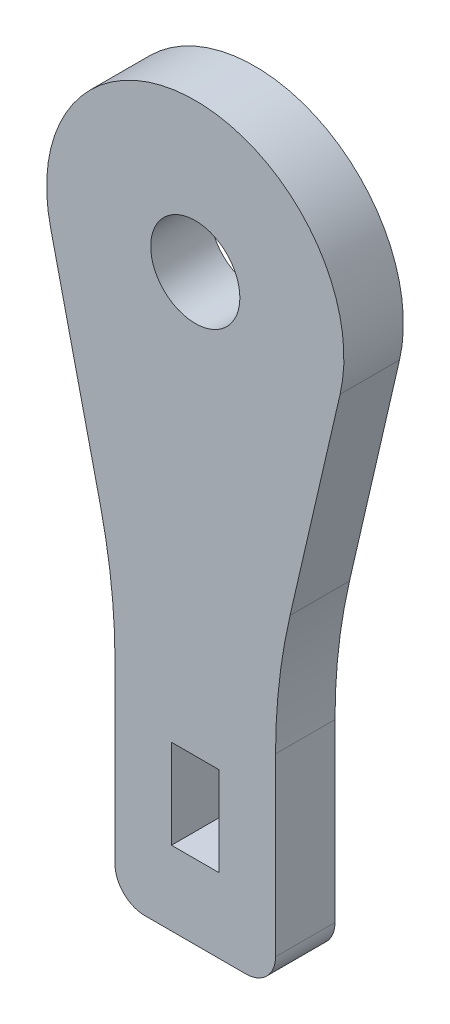
ISO-10303-21;
HEADER;
FILE_DESCRIPTION(('STEP AP214'),'2;1');
FILE_NAME('part.step','',(''),(''),'','','');
FILE_SCHEMA(('AUTOMOTIVE_DESIGN { 1 0 10303 214 1 1 1 1 }'));
ENDSEC;
DATA;
#1=APPLICATION_CONTEXT('core data for automotive mechanical design processes');
#2=APPLICATION_PROTOCOL_DEFINITION('international standard','automotive_design',2000,#1);
#3=PRODUCT_CONTEXT('',#1,'mechanical');
#4=PRODUCT('Part','Part','',(#3));
#5=PRODUCT_RELATED_PRODUCT_CATEGORY('part','',(#4));
#6=PRODUCT_DEFINITION_FORMATION('','',#4);
#7=PRODUCT_DEFINITION_CONTEXT('part definition',#1,'design');
#8=PRODUCT_DEFINITION('design','',#6,#7);
#9=PRODUCT_DEFINITION_SHAPE('','',#8);
#10=(LENGTH_UNIT() NAMED_UNIT(*) SI_UNIT(.MILLI.,.METRE.));
#11=(NAMED_UNIT(*) PLANE_ANGLE_UNIT() SI_UNIT($,.RADIAN.));
#12=(NAMED_UNIT(*) SI_UNIT($,.STERADIAN.) SOLID_ANGLE_UNIT());
#13=UNCERTAINTY_MEASURE_WITH_UNIT(LENGTH_MEASURE(1.E-05),#10,'distance_accuracy_value','');
#14=(GEOMETRIC_REPRESENTATION_CONTEXT(3) GLOBAL_UNCERTAINTY_ASSIGNED_CONTEXT((#13)) GLOBAL_UNIT_ASSIGNED_CONTEXT((#10,
#11,#12)) REPRESENTATION_CONTEXT('',''));
#15=CARTESIAN_POINT('',(0.,0.,0.));
#16=DIRECTION('',(0.,0.,1.));
#17=DIRECTION('',(1.,0.,0.));
#18=AXIS2_PLACEMENT_3D('',#15,#16,#17);
#19=CARTESIAN_POINT('',(-55.0000000000146,-1.51941047348276E-11,10.));
#20=DIRECTION('',(0.,0.,1.));
#21=DIRECTION('',(1.,0.,0.));
#22=AXIS2_PLACEMENT_3D('',#19,#20,#21);
#23=PLANE('',#22);
#24=CARTESIAN_POINT('',(-55.0000000000146,-1.51941047348276E-11,10.));
#25=DIRECTION('',(0.,0.,1.));
#26=DIRECTION('',(1.,0.,0.));
#27=AXIS2_PLACEMENT_3D('',#24,#25,#26);
#28=CIRCLE('',#27,25.);
#29=CARTESIAN_POINT('',(-30.6420643207286,-5.62947328299327,10.));
#30=VERTEX_POINT('',#29);
#31=CARTESIAN_POINT('',(-79.3579356793006,-5.62947328299327,10.));
#32=VERTEX_POINT('',#31);
#33=EDGE_CURVE('E182',#30,#32,#28,.T.);
#34=ORIENTED_EDGE('',*,*,#33,.T.);
#35=DIRECTION('',(0.225178931319123,-0.974317427171442,0.));
#36=VECTOR('',#35,1.);
#37=CARTESIAN_POINT('',(-79.3579356793006,-5.62947328299327,10.));
#38=LINE('',#37,#36);
#39=CARTESIAN_POINT('',(-70.9410499161308,-42.0481490157845,10.));
#40=VERTEX_POINT('',#39);
#41=EDGE_CURVE('E185',#32,#40,#38,.T.);
#42=ORIENTED_EDGE('',*,*,#41,.T.);
#43=CARTESIAN_POINT('',(-163.501205497418,-63.4401474911012,10.));
#44=DIRECTION('',(0.,0.,-1.));
#45=DIRECTION('',(1.,0.,0.));
#46=AXIS2_PLACEMENT_3D('',#43,#44,#45);
#47=CIRCLE('',#46,95.);
#48=CARTESIAN_POINT('',(-68.5012054974177,-63.4401474911012,10.));
#49=VERTEX_POINT('',#48);
#50=EDGE_CURVE('E188',#40,#49,#47,.T.);
#51=ORIENTED_EDGE('',*,*,#50,.T.);
#52=DIRECTION('',(0.,-1.,0.));
#53=VECTOR('',#52,1.);
#54=CARTESIAN_POINT('',(-68.5012054974177,-63.4401474911012,10.));
#55=LINE('',#54,#53);
#56=CARTESIAN_POINT('',(-68.5012054974177,-93.0000000000151,10.));
#57=VERTEX_POINT('',#56);
#58=EDGE_CURVE('E190',#49,#57,#55,.T.);
#59=ORIENTED_EDGE('',*,*,#58,.T.);
#60=CARTESIAN_POINT('',(-63.5012054974177,-93.0000000000152,10.));
#61=DIRECTION('',(0.,0.,1.));
#62=DIRECTION('',(-1.,0.,0.));
#63=AXIS2_PLACEMENT_3D('',#60,#61,#62);
#64=CIRCLE('',#63,5.);
#65=CARTESIAN_POINT('',(-63.5012054974177,-98.0000000000152,10.));
#66=VERTEX_POINT('',#65);
#67=EDGE_CURVE('E192',#57,#66,#64,.T.);
#68=ORIENTED_EDGE('',*,*,#67,.T.);
#69=DIRECTION('',(1.,0.,0.));
#70=VECTOR('',#69,1.);
#71=CARTESIAN_POINT('',(-63.5012054974177,-98.0000000000152,10.));
#72=LINE('',#71,#70);
#73=CARTESIAN_POINT('',(-46.4987945026115,-98.0000000000152,10.));
#74=VERTEX_POINT('',#73);
#75=EDGE_CURVE('E194',#66,#74,#72,.T.);
#76=ORIENTED_EDGE('',*,*,#75,.T.);
#77=CARTESIAN_POINT('',(-46.4987945026114,-93.0000000000152,10.));
#78=DIRECTION('',(0.,0.,1.));
#79=DIRECTION('',(-1.,0.,0.));
#80=AXIS2_PLACEMENT_3D('',#77,#78,#79);
#81=CIRCLE('',#80,5.);
#82=CARTESIAN_POINT('',(-41.4987945026114,-93.0000000000151,10.));
#83=VERTEX_POINT('',#82);
#84=EDGE_CURVE('E196',#74,#83,#81,.T.);
#85=ORIENTED_EDGE('',*,*,#84,.T.);
#86=DIRECTION('',(0.,1.,0.));
#87=VECTOR('',#86,1.);
#88=CARTESIAN_POINT('',(-41.4987945026115,-63.4401474911012,10.));
#89=LINE('',#88,#87);
#90=CARTESIAN_POINT('',(-41.4987945026115,-63.4401474911012,10.));
#91=VERTEX_POINT('',#90);
#92=EDGE_CURVE('E198',#83,#91,#89,.T.);
#93=ORIENTED_EDGE('',*,*,#92,.T.);
#94=CARTESIAN_POINT('',(53.5012054973885,-63.4401474911012,10.));
#95=DIRECTION('',(0.,0.,-1.));
#96=DIRECTION('',(-1.,0.,0.));
#97=AXIS2_PLACEMENT_3D('',#94,#95,#96);
#98=CIRCLE('',#97,95.);
#99=CARTESIAN_POINT('',(-39.0589500838984,-42.0481490157845,10.));
#100=VERTEX_POINT('',#99);
#101=EDGE_CURVE('E200',#91,#100,#98,.T.);
#102=ORIENTED_EDGE('',*,*,#101,.T.);
#103=DIRECTION('',(0.225178931319123,0.974317427171442,0.));
#104=VECTOR('',#103,1.);
#105=CARTESIAN_POINT('',(-30.6420643207286,-5.62947328299327,10.));
#106=LINE('',#105,#104);
#107=EDGE_CURVE('E202',#100,#30,#106,.T.);
#108=ORIENTED_EDGE('',*,*,#107,.T.);
#109=EDGE_LOOP('',(#34,#42,#51,#59,#68,#76,#85,#93,#102,#108));
#110=FACE_BOUND('',#109,.T.);
#111=CARTESIAN_POINT('',(-55.0000000000146,-1.51941047348276E-11,10.));
#112=DIRECTION('',(0.,0.,1.));
#113=DIRECTION('',(1.,0.,0.));
#114=AXIS2_PLACEMENT_3D('',#111,#112,#113);
#115=CIRCLE('',#114,7.50000000000527);
#116=CARTESIAN_POINT('',(-47.5000000000093,-1.51941047348276E-11,10.));
#117=VERTEX_POINT('',#116);
#118=EDGE_CURVE('E176',#117,#117,#115,.T.);
#119=ORIENTED_EDGE('',*,*,#118,.F.);
#120=EDGE_LOOP('',(#119));
#121=FACE_BOUND('',#120,.T.);
#122=DIRECTION('',(-1.,0.,0.));
#123=VECTOR('',#122,1.);
#124=CARTESIAN_POINT('',(-59.0000000000146,-70.5000000000152,10.));
#125=LINE('',#124,#123);
#126=CARTESIAN_POINT('',(-51.0000000000146,-70.5000000000152,10.));
#127=VERTEX_POINT('',#126);
#128=CARTESIAN_POINT('',(-59.0000000000146,-70.5000000000152,10.));
#129=VERTEX_POINT('',#128);
#130=EDGE_CURVE('E148',#127,#129,#125,.T.);
#131=ORIENTED_EDGE('',*,*,#130,.F.);
#132=DIRECTION('',(0.,1.,0.));
#133=VECTOR('',#132,1.);
#134=CARTESIAN_POINT('',(-51.0000000000146,-70.5000000000152,10.));
#135=LINE('',#134,#133);
#136=CARTESIAN_POINT('',(-51.0000000000146,-85.5000000000152,10.));
#137=VERTEX_POINT('',#136);
#138=EDGE_CURVE('E140',#137,#127,#135,.T.);
#139=ORIENTED_EDGE('',*,*,#138,.F.);
#140=DIRECTION('',(1.,0.,0.));
#141=VECTOR('',#140,1.);
#142=CARTESIAN_POINT('',(-59.0000000000146,-85.5000000000152,10.));
#143=LINE('',#142,#141);
#144=CARTESIAN_POINT('',(-59.0000000000146,-85.5000000000152,10.));
#145=VERTEX_POINT('',#144);
#146=EDGE_CURVE('E162',#145,#137,#143,.T.);
#147=ORIENTED_EDGE('',*,*,#146,.F.);
#148=DIRECTION('',(0.,-1.,0.));
#149=VECTOR('',#148,1.);
#150=CARTESIAN_POINT('',(-59.0000000000146,-70.5000000000152,10.));
#151=LINE('',#150,#149);
#152=EDGE_CURVE('E160',#129,#145,#151,.T.);
#153=ORIENTED_EDGE('',*,*,#152,.F.);
#154=EDGE_LOOP('',(#131,#139,#147,#153));
#155=FACE_BOUND('',#154,.T.);
#156=ADVANCED_FACE('F39',(#110,#121,#155),#23,.T.);
#157=CARTESIAN_POINT('',(-55.0000000000146,-1.51941047348276E-11,0.));
#158=DIRECTION('',(0.,0.,1.));
#159=DIRECTION('',(1.,0.,0.));
#160=AXIS2_PLACEMENT_3D('',#157,#158,#159);
#161=PLANE('',#160);
#162=CARTESIAN_POINT('',(-55.0000000000146,-1.51941047348276E-11,0.));
#163=DIRECTION('',(0.,0.,1.));
#164=DIRECTION('',(1.,0.,0.));
#165=AXIS2_PLACEMENT_3D('',#162,#163,#164);
#166=CIRCLE('',#165,7.50000000000527);
#167=CARTESIAN_POINT('',(-47.5000000000093,-1.51941047348276E-11,0.));
#168=VERTEX_POINT('',#167);
#169=EDGE_CURVE('E156',#168,#168,#166,.T.);
#170=ORIENTED_EDGE('',*,*,#169,.T.);
#171=EDGE_LOOP('',(#170));
#172=FACE_BOUND('',#171,.T.);
#173=CARTESIAN_POINT('',(-55.0000000000146,-1.51941047348276E-11,0.));
#174=DIRECTION('',(0.,0.,1.));
#175=DIRECTION('',(1.,0.,0.));
#176=AXIS2_PLACEMENT_3D('',#173,#174,#175);
#177=CIRCLE('',#176,25.);
#178=CARTESIAN_POINT('',(-30.6420643207286,-5.62947328299327,0.));
#179=VERTEX_POINT('',#178);
#180=CARTESIAN_POINT('',(-79.3579356793006,-5.62947328299327,0.));
#181=VERTEX_POINT('',#180);
#182=EDGE_CURVE('E179',#179,#181,#177,.T.);
#183=ORIENTED_EDGE('',*,*,#182,.F.);
#184=DIRECTION('',(0.225178931319123,0.974317427171442,0.));
#185=VECTOR('',#184,1.);
#186=CARTESIAN_POINT('',(-30.6420643207286,-5.62947328299327,0.));
#187=LINE('',#186,#185);
#188=CARTESIAN_POINT('',(-39.0589500838984,-42.0481490157845,0.));
#189=VERTEX_POINT('',#188);
#190=EDGE_CURVE('E186',#189,#179,#187,.T.);
#191=ORIENTED_EDGE('',*,*,#190,.F.);
#192=CARTESIAN_POINT('',(53.5012054973885,-63.4401474911012,0.));
#193=DIRECTION('',(0.,0.,-1.));
#194=DIRECTION('',(-1.,0.,0.));
#195=AXIS2_PLACEMENT_3D('',#192,#193,#194);
#196=CIRCLE('',#195,95.);
#197=CARTESIAN_POINT('',(-41.4987945026115,-63.4401474911012,0.));
#198=VERTEX_POINT('',#197);
#199=EDGE_CURVE('E221',#198,#189,#196,.T.);
#200=ORIENTED_EDGE('',*,*,#199,.F.);
#201=DIRECTION('',(0.,1.,0.));
#202=VECTOR('',#201,1.);
#203=CARTESIAN_POINT('',(-41.4987945026115,-63.4401474911012,0.));
#204=LINE('',#203,#202);
#205=CARTESIAN_POINT('',(-41.4987945026114,-93.0000000000151,0.));
#206=VERTEX_POINT('',#205);
#207=EDGE_CURVE('E219',#206,#198,#204,.T.);
#208=ORIENTED_EDGE('',*,*,#207,.F.);
#209=CARTESIAN_POINT('',(-46.4987945026114,-93.0000000000152,0.));
#210=DIRECTION('',(0.,0.,1.));
#211=DIRECTION('',(-1.,0.,0.));
#212=AXIS2_PLACEMENT_3D('',#209,#210,#211);
#213=CIRCLE('',#212,5.);
#214=CARTESIAN_POINT('',(-46.4987945026115,-98.0000000000152,0.));
#215=VERTEX_POINT('',#214);
#216=EDGE_CURVE('E217',#215,#206,#213,.T.);
#217=ORIENTED_EDGE('',*,*,#216,.F.);
#218=DIRECTION('',(1.,0.,0.));
#219=VECTOR('',#218,1.);
#220=CARTESIAN_POINT('',(-63.5012054974177,-98.0000000000152,0.));
#221=LINE('',#220,#219);
#222=CARTESIAN_POINT('',(-63.5012054974177,-98.0000000000152,0.));
#223=VERTEX_POINT('',#222);
#224=EDGE_CURVE('E215',#223,#215,#221,.T.);
#225=ORIENTED_EDGE('',*,*,#224,.F.);
#226=CARTESIAN_POINT('',(-63.5012054974177,-93.0000000000152,0.));
#227=DIRECTION('',(0.,0.,1.));
#228=DIRECTION('',(-1.,0.,0.));
#229=AXIS2_PLACEMENT_3D('',#226,#227,#228);
#230=CIRCLE('',#229,5.);
#231=CARTESIAN_POINT('',(-68.5012054974177,-93.0000000000151,0.));
#232=VERTEX_POINT('',#231);
#233=EDGE_CURVE('E213',#232,#223,#230,.T.);
#234=ORIENTED_EDGE('',*,*,#233,.F.);
#235=DIRECTION('',(0.,-1.,0.));
#236=VECTOR('',#235,1.);
#237=CARTESIAN_POINT('',(-68.5012054974177,-63.4401474911012,0.));
#238=LINE('',#237,#236);
#239=CARTESIAN_POINT('',(-68.5012054974177,-63.4401474911012,0.));
#240=VERTEX_POINT('',#239);
#241=EDGE_CURVE('E211',#240,#232,#238,.T.);
#242=ORIENTED_EDGE('',*,*,#241,.F.);
#243=CARTESIAN_POINT('',(-163.501205497418,-63.4401474911012,0.));
#244=DIRECTION('',(0.,0.,-1.));
#245=DIRECTION('',(1.,0.,0.));
#246=AXIS2_PLACEMENT_3D('',#243,#244,#245);
#247=CIRCLE('',#246,95.);
#248=CARTESIAN_POINT('',(-70.9410499161308,-42.0481490157845,0.));
#249=VERTEX_POINT('',#248);
#250=EDGE_CURVE('E209',#249,#240,#247,.T.);
#251=ORIENTED_EDGE('',*,*,#250,.F.);
#252=DIRECTION('',(0.225178931319123,-0.974317427171442,0.));
#253=VECTOR('',#252,1.);
#254=CARTESIAN_POINT('',(-79.3579356793006,-5.62947328299327,0.));
#255=LINE('',#254,#253);
#256=EDGE_CURVE('E207',#181,#249,#255,.T.);
#257=ORIENTED_EDGE('',*,*,#256,.F.);
#258=EDGE_LOOP('',(#183,#191,#200,#208,#217,#225,#234,#242,#251,#257));
#259=FACE_BOUND('',#258,.T.);
#260=DIRECTION('',(0.,1.,0.));
#261=VECTOR('',#260,1.);
#262=CARTESIAN_POINT('',(-51.0000000000146,-70.5000000000152,0.));
#263=LINE('',#262,#261);
#264=CARTESIAN_POINT('',(-51.0000000000146,-85.5000000000152,0.));
#265=VERTEX_POINT('',#264);
#266=CARTESIAN_POINT('',(-51.0000000000146,-70.5000000000152,0.));
#267=VERTEX_POINT('',#266);
#268=EDGE_CURVE('E62',#265,#267,#263,.T.);
#269=ORIENTED_EDGE('',*,*,#268,.T.);
#270=DIRECTION('',(-1.,0.,0.));
#271=VECTOR('',#270,1.);
#272=CARTESIAN_POINT('',(-59.0000000000146,-70.5000000000152,0.));
#273=LINE('',#272,#271);
#274=CARTESIAN_POINT('',(-59.0000000000146,-70.5000000000152,0.));
#275=VERTEX_POINT('',#274);
#276=EDGE_CURVE('E155',#267,#275,#273,.T.);
#277=ORIENTED_EDGE('',*,*,#276,.T.);
#278=DIRECTION('',(0.,-1.,0.));
#279=VECTOR('',#278,1.);
#280=CARTESIAN_POINT('',(-59.0000000000146,-70.5000000000152,0.));
#281=LINE('',#280,#279);
#282=CARTESIAN_POINT('',(-59.0000000000146,-85.5000000000152,0.));
#283=VERTEX_POINT('',#282);
#284=EDGE_CURVE('E168',#275,#283,#281,.T.);
#285=ORIENTED_EDGE('',*,*,#284,.T.);
#286=DIRECTION('',(1.,0.,0.));
#287=VECTOR('',#286,1.);
#288=CARTESIAN_POINT('',(-59.0000000000146,-85.5000000000152,0.));
#289=LINE('',#288,#287);
#290=EDGE_CURVE('E149',#283,#265,#289,.T.);
#291=ORIENTED_EDGE('',*,*,#290,.T.);
#292=EDGE_LOOP('',(#269,#277,#285,#291));
#293=FACE_BOUND('',#292,.T.);
#294=ADVANCED_FACE('F257',(#172,#259,#293),#161,.F.);
#295=CARTESIAN_POINT('',(-55.0000000000146,-1.51941047348276E-11,10.));
#296=DIRECTION('',(0.,0.,-1.));
#297=DIRECTION('',(-1.,0.,0.));
#298=AXIS2_PLACEMENT_3D('',#295,#296,#297);
#299=CYLINDRICAL_SURFACE('',#298,25.);
#300=ORIENTED_EDGE('',*,*,#182,.T.);
#301=DIRECTION('',(0.,0.,-1.));
#302=VECTOR('',#301,1.);
#303=CARTESIAN_POINT('',(-79.3579356793006,-5.62947328299327,10.));
#304=LINE('',#303,#302);
#305=EDGE_CURVE('E11',#32,#181,#304,.T.);
#306=ORIENTED_EDGE('',*,*,#305,.F.);
#307=ORIENTED_EDGE('',*,*,#33,.F.);
#308=DIRECTION('',(0.,0.,-1.));
#309=VECTOR('',#308,1.);
#310=CARTESIAN_POINT('',(-30.6420643207286,-5.62947328299327,10.));
#311=LINE('',#310,#309);
#312=EDGE_CURVE('E204',#30,#179,#311,.T.);
#313=ORIENTED_EDGE('',*,*,#312,.T.);
#314=EDGE_LOOP('',(#300,#306,#307,#313));
#315=FACE_BOUND('',#314,.T.);
#316=ADVANCED_FACE('F41',(#315),#299,.T.);
#317=CARTESIAN_POINT('',(-79.3579356793006,-5.62947328299327,10.));
#318=DIRECTION('',(0.974317427171442,0.225178931319123,0.));
#319=DIRECTION('',(-0.225178931319123,0.974317427171442,0.));
#320=AXIS2_PLACEMENT_3D('',#317,#318,#319);
#321=PLANE('',#320);
#322=ORIENTED_EDGE('',*,*,#256,.T.);
#323=DIRECTION('',(0.,0.,-1.));
#324=VECTOR('',#323,1.);
#325=CARTESIAN_POINT('',(-70.9410499161308,-42.0481490157845,10.));
#326=LINE('',#325,#324);
#327=EDGE_CURVE('E47',#40,#249,#326,.T.);
#328=ORIENTED_EDGE('',*,*,#327,.F.);
#329=ORIENTED_EDGE('',*,*,#41,.F.);
#330=ORIENTED_EDGE('',*,*,#305,.T.);
#331=EDGE_LOOP('',(#322,#328,#329,#330));
#332=FACE_BOUND('',#331,.T.);
#333=ADVANCED_FACE('F275',(#332),#321,.F.);
#334=CARTESIAN_POINT('',(-163.501205497418,-63.4401474911012,10.));
#335=DIRECTION('',(0.,0.,-1.));
#336=DIRECTION('',(-1.,0.,0.));
#337=AXIS2_PLACEMENT_3D('',#334,#335,#336);
#338=CYLINDRICAL_SURFACE('',#337,95.);
#339=ORIENTED_EDGE('',*,*,#250,.T.);
#340=DIRECTION('',(0.,0.,-1.));
#341=VECTOR('',#340,1.);
#342=CARTESIAN_POINT('',(-68.5012054974177,-63.4401474911012,10.));
#343=LINE('',#342,#341);
#344=EDGE_CURVE('E244',#49,#240,#343,.T.);
#345=ORIENTED_EDGE('',*,*,#344,.F.);
#346=ORIENTED_EDGE('',*,*,#50,.F.);
#347=ORIENTED_EDGE('',*,*,#327,.T.);
#348=EDGE_LOOP('',(#339,#345,#346,#347));
#349=FACE_BOUND('',#348,.T.);
#350=ADVANCED_FACE('F251',(#349),#338,.F.);
#351=CARTESIAN_POINT('',(-68.5012054974177,-63.4401474911012,10.));
#352=DIRECTION('',(1.,0.,0.));
#353=DIRECTION('',(0.,1.,0.));
#354=AXIS2_PLACEMENT_3D('',#351,#352,#353);
#355=PLANE('',#354);
#356=ORIENTED_EDGE('',*,*,#241,.T.);
#357=DIRECTION('',(0.,0.,-1.));
#358=VECTOR('',#357,1.);
#359=CARTESIAN_POINT('',(-68.5012054974177,-93.0000000000151,10.));
#360=LINE('',#359,#358);
#361=EDGE_CURVE('E241',#57,#232,#360,.T.);
#362=ORIENTED_EDGE('',*,*,#361,.F.);
#363=ORIENTED_EDGE('',*,*,#58,.F.);
#364=ORIENTED_EDGE('',*,*,#344,.T.);
#365=EDGE_LOOP('',(#356,#362,#363,#364));
#366=FACE_BOUND('',#365,.T.);
#367=ADVANCED_FACE('F263',(#366),#355,.F.);
#368=CARTESIAN_POINT('',(-63.5012054974177,-93.0000000000152,10.));
#369=DIRECTION('',(0.,0.,-1.));
#370=DIRECTION('',(-1.,0.,0.));
#371=AXIS2_PLACEMENT_3D('',#368,#369,#370);
#372=CYLINDRICAL_SURFACE('',#371,5.);
#373=ORIENTED_EDGE('',*,*,#233,.T.);
#374=DIRECTION('',(0.,0.,-1.));
#375=VECTOR('',#374,1.);
#376=CARTESIAN_POINT('',(-63.5012054974177,-98.0000000000152,10.));
#377=LINE('',#376,#375);
#378=EDGE_CURVE('E238',#66,#223,#377,.T.);
#379=ORIENTED_EDGE('',*,*,#378,.F.);
#380=ORIENTED_EDGE('',*,*,#67,.F.);
#381=ORIENTED_EDGE('',*,*,#361,.T.);
#382=EDGE_LOOP('',(#373,#379,#380,#381));
#383=FACE_BOUND('',#382,.T.);
#384=ADVANCED_FACE('F267',(#383),#372,.T.);
#385=CARTESIAN_POINT('',(-63.5012054974177,-98.0000000000152,10.));
#386=DIRECTION('',(0.,1.,0.));
#387=DIRECTION('',(0.,0.,1.));
#388=AXIS2_PLACEMENT_3D('',#385,#386,#387);
#389=PLANE('',#388);
#390=ORIENTED_EDGE('',*,*,#224,.T.);
#391=DIRECTION('',(0.,0.,-1.));
#392=VECTOR('',#391,1.);
#393=CARTESIAN_POINT('',(-46.4987945026115,-98.0000000000152,10.));
#394=LINE('',#393,#392);
#395=EDGE_CURVE('E235',#74,#215,#394,.T.);
#396=ORIENTED_EDGE('',*,*,#395,.F.);
#397=ORIENTED_EDGE('',*,*,#75,.F.);
#398=ORIENTED_EDGE('',*,*,#378,.T.);
#399=EDGE_LOOP('',(#390,#396,#397,#398));
#400=FACE_BOUND('',#399,.T.);
#401=ADVANCED_FACE('F298',(#400),#389,.F.);
#402=CARTESIAN_POINT('',(-46.4987945026114,-93.0000000000152,10.));
#403=DIRECTION('',(0.,0.,-1.));
#404=DIRECTION('',(-1.,0.,0.));
#405=AXIS2_PLACEMENT_3D('',#402,#403,#404);
#406=CYLINDRICAL_SURFACE('',#405,5.);
#407=ORIENTED_EDGE('',*,*,#216,.T.);
#408=DIRECTION('',(0.,0.,-1.));
#409=VECTOR('',#408,1.);
#410=CARTESIAN_POINT('',(-41.4987945026114,-93.0000000000151,10.));
#411=LINE('',#410,#409);
#412=EDGE_CURVE('E232',#83,#206,#411,.T.);
#413=ORIENTED_EDGE('',*,*,#412,.F.);
#414=ORIENTED_EDGE('',*,*,#84,.F.);
#415=ORIENTED_EDGE('',*,*,#395,.T.);
#416=EDGE_LOOP('',(#407,#413,#414,#415));
#417=FACE_BOUND('',#416,.T.);
#418=ADVANCED_FACE('F295',(#417),#406,.T.);
#419=CARTESIAN_POINT('',(-41.4987945026115,-63.4401474911012,10.));
#420=DIRECTION('',(-1.,0.,0.));
#421=DIRECTION('',(0.,-1.,0.));
#422=AXIS2_PLACEMENT_3D('',#419,#420,#421);
#423=PLANE('',#422);
#424=ORIENTED_EDGE('',*,*,#207,.T.);
#425=DIRECTION('',(0.,0.,-1.));
#426=VECTOR('',#425,1.);
#427=CARTESIAN_POINT('',(-41.4987945026115,-63.4401474911012,10.));
#428=LINE('',#427,#426);
#429=EDGE_CURVE('E229',#91,#198,#428,.T.);
#430=ORIENTED_EDGE('',*,*,#429,.F.);
#431=ORIENTED_EDGE('',*,*,#92,.F.);
#432=ORIENTED_EDGE('',*,*,#412,.T.);
#433=EDGE_LOOP('',(#424,#430,#431,#432));
#434=FACE_BOUND('',#433,.T.);
#435=ADVANCED_FACE('F291',(#434),#423,.F.);
#436=CARTESIAN_POINT('',(53.5012054973885,-63.4401474911012,10.));
#437=DIRECTION('',(0.,0.,-1.));
#438=DIRECTION('',(-1.,0.,0.));
#439=AXIS2_PLACEMENT_3D('',#436,#437,#438);
#440=CYLINDRICAL_SURFACE('',#439,95.);
#441=ORIENTED_EDGE('',*,*,#199,.T.);
#442=DIRECTION('',(0.,0.,-1.));
#443=VECTOR('',#442,1.);
#444=CARTESIAN_POINT('',(-39.0589500838984,-42.0481490157845,10.));
#445=LINE('',#444,#443);
#446=EDGE_CURVE('E226',#100,#189,#445,.T.);
#447=ORIENTED_EDGE('',*,*,#446,.F.);
#448=ORIENTED_EDGE('',*,*,#101,.F.);
#449=ORIENTED_EDGE('',*,*,#429,.T.);
#450=EDGE_LOOP('',(#441,#447,#448,#449));
#451=FACE_BOUND('',#450,.T.);
#452=ADVANCED_FACE('F287',(#451),#440,.F.);
#453=CARTESIAN_POINT('',(-30.6420643207286,-5.62947328299327,10.));
#454=DIRECTION('',(-0.974317427171442,0.225178931319123,0.));
#455=DIRECTION('',(-0.225178931319123,-0.974317427171442,0.));
#456=AXIS2_PLACEMENT_3D('',#453,#454,#455);
#457=PLANE('',#456);
#458=ORIENTED_EDGE('',*,*,#190,.T.);
#459=ORIENTED_EDGE('',*,*,#312,.F.);
#460=ORIENTED_EDGE('',*,*,#107,.F.);
#461=ORIENTED_EDGE('',*,*,#446,.T.);
#462=EDGE_LOOP('',(#458,#459,#460,#461));
#463=FACE_BOUND('',#462,.T.);
#464=ADVANCED_FACE('F282',(#463),#457,.F.);
#465=CARTESIAN_POINT('',(-55.0000000000146,-1.51941047348276E-11,10.));
#466=DIRECTION('',(0.,0.,-1.));
#467=DIRECTION('',(-1.,0.,0.));
#468=AXIS2_PLACEMENT_3D('',#465,#466,#467);
#469=CYLINDRICAL_SURFACE('',#468,7.50000000000527);
#470=ORIENTED_EDGE('',*,*,#118,.T.);
#471=EDGE_LOOP('',(#470));
#472=FACE_BOUND('',#471,.T.);
#473=ORIENTED_EDGE('',*,*,#169,.F.);
#474=EDGE_LOOP('',(#473));
#475=FACE_BOUND('',#474,.T.);
#476=ADVANCED_FACE('F315',(#472,#475),#469,.F.);
#477=CARTESIAN_POINT('',(-51.0000000000146,-70.5000000000152,10.));
#478=DIRECTION('',(-1.,0.,0.));
#479=DIRECTION('',(0.,0.,1.));
#480=AXIS2_PLACEMENT_3D('',#477,#478,#479);
#481=PLANE('',#480);
#482=ORIENTED_EDGE('',*,*,#268,.F.);
#483=DIRECTION('',(0.,0.,-1.));
#484=VECTOR('',#483,1.);
#485=CARTESIAN_POINT('',(-51.0000000000146,-85.5000000000152,10.));
#486=LINE('',#485,#484);
#487=EDGE_CURVE('E144',#137,#265,#486,.T.);
#488=ORIENTED_EDGE('',*,*,#487,.F.);
#489=ORIENTED_EDGE('',*,*,#138,.T.);
#490=DIRECTION('',(0.,0.,-1.));
#491=VECTOR('',#490,1.);
#492=CARTESIAN_POINT('',(-51.0000000000146,-70.5000000000152,10.));
#493=LINE('',#492,#491);
#494=EDGE_CURVE('E143',#127,#267,#493,.T.);
#495=ORIENTED_EDGE('',*,*,#494,.T.);
#496=EDGE_LOOP('',(#482,#488,#489,#495));
#497=FACE_BOUND('',#496,.T.);
#498=ADVANCED_FACE('F142',(#497),#481,.T.);
#499=CARTESIAN_POINT('',(-59.0000000000146,-70.5000000000152,10.));
#500=DIRECTION('',(0.,-1.,0.));
#501=DIRECTION('',(0.,0.,-1.));
#502=AXIS2_PLACEMENT_3D('',#499,#500,#501);
#503=PLANE('',#502);
#504=ORIENTED_EDGE('',*,*,#276,.F.);
#505=ORIENTED_EDGE('',*,*,#494,.F.);
#506=ORIENTED_EDGE('',*,*,#130,.T.);
#507=DIRECTION('',(0.,0.,-1.));
#508=VECTOR('',#507,1.);
#509=CARTESIAN_POINT('',(-59.0000000000146,-70.5000000000152,10.));
#510=LINE('',#509,#508);
#511=EDGE_CURVE('E157',#129,#275,#510,.T.);
#512=ORIENTED_EDGE('',*,*,#511,.T.);
#513=EDGE_LOOP('',(#504,#505,#506,#512));
#514=FACE_BOUND('',#513,.T.);
#515=ADVANCED_FACE('F152',(#514),#503,.T.);
#516=CARTESIAN_POINT('',(-59.0000000000146,-70.5000000000152,10.));
#517=DIRECTION('',(1.,0.,0.));
#518=DIRECTION('',(0.,0.,-1.));
#519=AXIS2_PLACEMENT_3D('',#516,#517,#518);
#520=PLANE('',#519);
#521=ORIENTED_EDGE('',*,*,#284,.F.);
#522=ORIENTED_EDGE('',*,*,#511,.F.);
#523=ORIENTED_EDGE('',*,*,#152,.T.);
#524=DIRECTION('',(0.,0.,-1.));
#525=VECTOR('',#524,1.);
#526=CARTESIAN_POINT('',(-59.0000000000146,-85.5000000000152,10.));
#527=LINE('',#526,#525);
#528=EDGE_CURVE('E54',#145,#283,#527,.T.);
#529=ORIENTED_EDGE('',*,*,#528,.T.);
#530=EDGE_LOOP('',(#521,#522,#523,#529));
#531=FACE_BOUND('',#530,.T.);
#532=ADVANCED_FACE('F352',(#531),#520,.T.);
#533=CARTESIAN_POINT('',(-59.0000000000146,-85.5000000000152,10.));
#534=DIRECTION('',(0.,1.,0.));
#535=DIRECTION('',(0.,0.,1.));
#536=AXIS2_PLACEMENT_3D('',#533,#534,#535);
#537=PLANE('',#536);
#538=ORIENTED_EDGE('',*,*,#290,.F.);
#539=ORIENTED_EDGE('',*,*,#528,.F.);
#540=ORIENTED_EDGE('',*,*,#146,.T.);
#541=ORIENTED_EDGE('',*,*,#487,.T.);
#542=EDGE_LOOP('',(#538,#539,#540,#541));
#543=FACE_BOUND('',#542,.T.);
#544=ADVANCED_FACE('F359',(#543),#537,.T.);
#545=CLOSED_SHELL('',(#156,#294,#316,#333,#350,#367,#384,#401,#418,#435,#452,#464,#476,#498,
#515,#532,#544));
#546=MANIFOLD_SOLID_BREP('B2',#545);
#547=ADVANCED_BREP_SHAPE_REPRESENTATION('',(#18,#546),#14);
#548=SHAPE_DEFINITION_REPRESENTATION(#9,#547);
ENDSEC;
END-ISO-10303-21;
